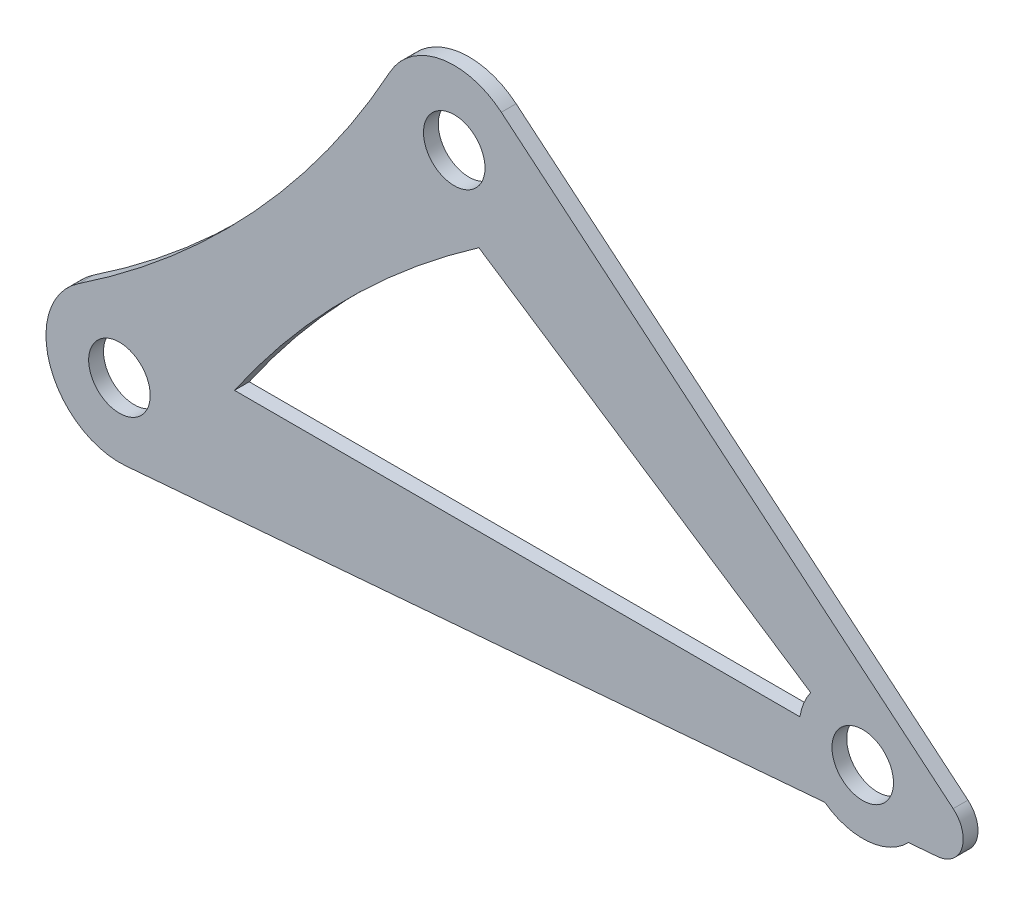
ISO-10303-21;
HEADER;
FILE_DESCRIPTION(('STEP AP214'),'2;1');
FILE_NAME('part.step','',(''),(''),'','','');
FILE_SCHEMA(('AUTOMOTIVE_DESIGN { 1 0 10303 214 1 1 1 1 }'));
ENDSEC;
DATA;
#1=APPLICATION_CONTEXT('core data for automotive mechanical design processes');
#2=APPLICATION_PROTOCOL_DEFINITION('international standard','automotive_design',2000,#1);
#3=PRODUCT_CONTEXT('',#1,'mechanical');
#4=PRODUCT('Part','Part','',(#3));
#5=PRODUCT_RELATED_PRODUCT_CATEGORY('part','',(#4));
#6=PRODUCT_DEFINITION_FORMATION('','',#4);
#7=PRODUCT_DEFINITION_CONTEXT('part definition',#1,'design');
#8=PRODUCT_DEFINITION('design','',#6,#7);
#9=PRODUCT_DEFINITION_SHAPE('','',#8);
#10=(LENGTH_UNIT() NAMED_UNIT(*) SI_UNIT(.MILLI.,.METRE.));
#11=(NAMED_UNIT(*) PLANE_ANGLE_UNIT() SI_UNIT($,.RADIAN.));
#12=(NAMED_UNIT(*) SI_UNIT($,.STERADIAN.) SOLID_ANGLE_UNIT());
#13=UNCERTAINTY_MEASURE_WITH_UNIT(LENGTH_MEASURE(1.E-05),#10,'distance_accuracy_value','');
#14=(GEOMETRIC_REPRESENTATION_CONTEXT(3) GLOBAL_UNCERTAINTY_ASSIGNED_CONTEXT((#13)) GLOBAL_UNIT_ASSIGNED_CONTEXT((#10,
#11,#12)) REPRESENTATION_CONTEXT('',''));
#15=CARTESIAN_POINT('',(0.,0.,0.));
#16=DIRECTION('',(0.,0.,1.));
#17=DIRECTION('',(1.,0.,0.));
#18=AXIS2_PLACEMENT_3D('',#15,#16,#17);
#19=CARTESIAN_POINT('',(-157.165870572563,93.085119743482,1.587));
#20=DIRECTION('',(0.,0.,-1.));
#21=DIRECTION('',(-1.,0.,0.));
#22=AXIS2_PLACEMENT_3D('',#19,#20,#21);
#23=CYLINDRICAL_SURFACE('',#22,104.);
#24=CARTESIAN_POINT('',(-157.165870572563,93.085119743482,0.));
#25=DIRECTION('',(0.,0.,1.));
#26=DIRECTION('',(1.,0.,0.));
#27=AXIS2_PLACEMENT_3D('',#24,#25,#26);
#28=CIRCLE('',#27,104.);
#29=CARTESIAN_POINT('',(-66.0670444084238,42.915369180858,0.));
#30=VERTEX_POINT('',#29);
#31=CARTESIAN_POINT('',(-99.4647440627846,6.56009446464992,0.));
#32=VERTEX_POINT('',#31);
#33=EDGE_CURVE('E216',#30,#32,#28,.F.);
#34=ORIENTED_EDGE('',*,*,#33,.T.);
#35=DIRECTION('',(0.,0.,-1.));
#36=VECTOR('',#35,1.);
#37=CARTESIAN_POINT('',(-99.4647440627846,6.56009446464992,1.587));
#38=LINE('',#37,#36);
#39=CARTESIAN_POINT('',(-99.4647440627846,6.56009446464992,1.587));
#40=VERTEX_POINT('',#39);
#41=EDGE_CURVE('E269',#40,#32,#38,.T.);
#42=ORIENTED_EDGE('',*,*,#41,.F.);
#43=CARTESIAN_POINT('',(-157.165870572563,93.085119743482,1.587));
#44=DIRECTION('',(0.,0.,1.));
#45=DIRECTION('',(1.,0.,0.));
#46=AXIS2_PLACEMENT_3D('',#43,#44,#45);
#47=CIRCLE('',#46,104.);
#48=CARTESIAN_POINT('',(-66.0670444084238,42.915369180858,1.587));
#49=VERTEX_POINT('',#48);
#50=EDGE_CURVE('E168',#49,#40,#47,.F.);
#51=ORIENTED_EDGE('',*,*,#50,.F.);
#52=DIRECTION('',(0.,0.,-1.));
#53=VECTOR('',#52,1.);
#54=CARTESIAN_POINT('',(-66.0670444084238,42.915369180858,1.587));
#55=LINE('',#54,#53);
#56=EDGE_CURVE('E154',#49,#30,#55,.T.);
#57=ORIENTED_EDGE('',*,*,#56,.T.);
#58=EDGE_LOOP('',(#34,#42,#51,#57));
#59=FACE_BOUND('',#58,.T.);
#60=ADVANCED_FACE('F43',(#59),#23,.F.);
#61=CARTESIAN_POINT('',(-95.09,0.,1.587));
#62=DIRECTION('',(0.,0.,-1.));
#63=DIRECTION('',(-1.,0.,0.));
#64=AXIS2_PLACEMENT_3D('',#61,#62,#63);
#65=CYLINDRICAL_SURFACE('',#64,7.885);
#66=CARTESIAN_POINT('',(-95.09,0.,0.));
#67=DIRECTION('',(0.,0.,1.));
#68=DIRECTION('',(1.,0.,0.));
#69=AXIS2_PLACEMENT_3D('',#66,#67,#68);
#70=CIRCLE('',#69,7.885);
#71=CARTESIAN_POINT('',(-94.4361644231781,-7.85784474512458,0.));
#72=VERTEX_POINT('',#71);
#73=EDGE_CURVE('E220',#32,#72,#70,.T.);
#74=ORIENTED_EDGE('',*,*,#73,.T.);
#75=DIRECTION('',(0.,0.,-1.));
#76=VECTOR('',#75,1.);
#77=CARTESIAN_POINT('',(-94.4361644231781,-7.85784474512458,1.587));
#78=LINE('',#77,#76);
#79=CARTESIAN_POINT('',(-94.4361644231781,-7.85784474512458,1.587));
#80=VERTEX_POINT('',#79);
#81=EDGE_CURVE('E266',#80,#72,#78,.T.);
#82=ORIENTED_EDGE('',*,*,#81,.F.);
#83=CARTESIAN_POINT('',(-95.09,0.,1.587));
#84=DIRECTION('',(0.,0.,1.));
#85=DIRECTION('',(1.,0.,0.));
#86=AXIS2_PLACEMENT_3D('',#83,#84,#85);
#87=CIRCLE('',#86,7.885);
#88=EDGE_CURVE('E172',#40,#80,#87,.T.);
#89=ORIENTED_EDGE('',*,*,#88,.F.);
#90=ORIENTED_EDGE('',*,*,#41,.T.);
#91=EDGE_LOOP('',(#74,#82,#89,#90));
#92=FACE_BOUND('',#91,.T.);
#93=ADVANCED_FACE('F341',(#92),#65,.T.);
#94=CARTESIAN_POINT('',(0.,0.,1.587));
#95=DIRECTION('',(0.0829214428436218,-0.99655608688961,0.));
#96=DIRECTION('',(0.99655608688961,0.0829214428436218,0.));
#97=AXIS2_PLACEMENT_3D('',#94,#95,#96);
#98=PLANE('',#97);
#99=DIRECTION('',(-0.99655608688961,-0.0829214428436219,0.));
#100=VECTOR('',#99,1.);
#101=CARTESIAN_POINT('',(0.,0.,0.));
#102=LINE('',#101,#100);
#103=CARTESIAN_POINT('',(-19.3842778919593,-1.61292707197226,0.));
#104=VERTEX_POINT('',#103);
#105=EDGE_CURVE('E224',#104,#72,#102,.T.);
#106=ORIENTED_EDGE('',*,*,#105,.F.);
#107=DIRECTION('',(0.,0.,-1.));
#108=VECTOR('',#107,1.);
#109=CARTESIAN_POINT('',(-19.3842778919593,-1.61292707197226,1.587));
#110=LINE('',#109,#108);
#111=CARTESIAN_POINT('',(-19.3842778919593,-1.61292707197226,1.587));
#112=VERTEX_POINT('',#111);
#113=EDGE_CURVE('E263',#112,#104,#110,.T.);
#114=ORIENTED_EDGE('',*,*,#113,.F.);
#115=DIRECTION('',(-0.99655608688961,-0.0829214428436219,0.));
#116=VECTOR('',#115,1.);
#117=CARTESIAN_POINT('',(0.,0.,1.587));
#118=LINE('',#117,#116);
#119=EDGE_CURVE('E175',#112,#80,#118,.T.);
#120=ORIENTED_EDGE('',*,*,#119,.T.);
#121=ORIENTED_EDGE('',*,*,#81,.T.);
#122=EDGE_LOOP('',(#106,#114,#120,#121));
#123=FACE_BOUND('',#122,.T.);
#124=ADVANCED_FACE('F346',(#123),#98,.T.);
#125=CARTESIAN_POINT('',(-15.3218333954721,3.885,1.587));
#126=DIRECTION('',(0.,0.,-1.));
#127=DIRECTION('',(-1.,0.,0.));
#128=AXIS2_PLACEMENT_3D('',#125,#126,#127);
#129=CYLINDRICAL_SURFACE('',#128,6.83598254647897);
#130=CARTESIAN_POINT('',(-15.3218333954721,3.885,0.));
#131=DIRECTION('',(0.,0.,1.));
#132=DIRECTION('',(1.,0.,0.));
#133=AXIS2_PLACEMENT_3D('',#130,#131,#132);
#134=CIRCLE('',#133,6.83598254647897);
#135=CARTESIAN_POINT('',(-10.4066033987028,-0.865912697011469,0.));
#136=VERTEX_POINT('',#135);
#137=EDGE_CURVE('E228',#104,#136,#134,.T.);
#138=ORIENTED_EDGE('',*,*,#137,.T.);
#139=DIRECTION('',(0.,0.,-1.));
#140=VECTOR('',#139,1.);
#141=CARTESIAN_POINT('',(-10.4066033987028,-0.865912697011469,1.587));
#142=LINE('',#141,#140);
#143=CARTESIAN_POINT('',(-10.4066033987028,-0.865912697011469,1.587));
#144=VERTEX_POINT('',#143);
#145=EDGE_CURVE('E259',#144,#136,#142,.T.);
#146=ORIENTED_EDGE('',*,*,#145,.F.);
#147=CARTESIAN_POINT('',(-15.3218333954721,3.885,1.587));
#148=DIRECTION('',(0.,0.,1.));
#149=DIRECTION('',(1.,0.,0.));
#150=AXIS2_PLACEMENT_3D('',#147,#148,#149);
#151=CIRCLE('',#150,6.83598254647897);
#152=EDGE_CURVE('E179',#112,#144,#151,.T.);
#153=ORIENTED_EDGE('',*,*,#152,.F.);
#154=ORIENTED_EDGE('',*,*,#113,.T.);
#155=EDGE_LOOP('',(#138,#146,#153,#154));
#156=FACE_BOUND('',#155,.T.);
#157=ADVANCED_FACE('F373',(#156),#129,.T.);
#158=CARTESIAN_POINT('',(0.,0.,1.587));
#159=DIRECTION('',(0.0829214428436218,-0.99655608688961,0.));
#160=DIRECTION('',(0.99655608688961,0.0829214428436218,0.));
#161=AXIS2_PLACEMENT_3D('',#158,#159,#160);
#162=PLANE('',#161);
#163=DIRECTION('',(-0.99655608688961,-0.0829214428436219,0.));
#164=VECTOR('',#163,1.);
#165=CARTESIAN_POINT('',(0.,0.,0.));
#166=LINE('',#165,#164);
#167=CARTESIAN_POINT('',(-7.28789729550852,-0.606411387166248,0.));
#168=VERTEX_POINT('',#167);
#169=EDGE_CURVE('E232',#168,#136,#166,.T.);
#170=ORIENTED_EDGE('',*,*,#169,.F.);
#171=DIRECTION('',(0.,0.,-1.));
#172=VECTOR('',#171,1.);
#173=CARTESIAN_POINT('',(-7.28789729550852,-0.606411387166247,1.587));
#174=LINE('',#173,#172);
#175=CARTESIAN_POINT('',(-7.28789729550852,-0.606411387166248,1.587));
#176=VERTEX_POINT('',#175);
#177=EDGE_CURVE('E52',#168,#176,#174,.F.);
#178=ORIENTED_EDGE('',*,*,#177,.T.);
#179=DIRECTION('',(-0.99655608688961,-0.0829214428436219,0.));
#180=VECTOR('',#179,1.);
#181=CARTESIAN_POINT('',(0.,0.,1.587));
#182=LINE('',#181,#180);
#183=EDGE_CURVE('E183',#176,#144,#182,.T.);
#184=ORIENTED_EDGE('',*,*,#183,.T.);
#185=ORIENTED_EDGE('',*,*,#145,.T.);
#186=EDGE_LOOP('',(#170,#178,#184,#185));
#187=FACE_BOUND('',#186,.T.);
#188=ADVANCED_FACE('F367',(#187),#162,.T.);
#189=CARTESIAN_POINT('',(0.,0.,1.587));
#190=DIRECTION('',(-0.640815984493603,-0.767694518684023,0.));
#191=DIRECTION('',(0.767694518684024,-0.640815984493603,0.));
#192=AXIS2_PLACEMENT_3D('',#189,#190,#191);
#193=PLANE('',#192);
#194=DIRECTION('',(-0.767694518684023,0.640815984493603,0.));
#195=VECTOR('',#194,1.);
#196=CARTESIAN_POINT('',(0.,0.,1.587));
#197=LINE('',#196,#195);
#198=CARTESIAN_POINT('',(-5.61421367055858,4.68634042955465,1.587));
#199=VERTEX_POINT('',#198);
#200=CARTESIAN_POINT('',(-54.1073426369971,45.1649050454287,1.587));
#201=VERTEX_POINT('',#200);
#202=EDGE_CURVE('E186',#199,#201,#197,.T.);
#203=ORIENTED_EDGE('',*,*,#202,.F.);
#204=DIRECTION('',(0.,0.,-1.));
#205=VECTOR('',#204,1.);
#206=CARTESIAN_POINT('',(-5.61421367055858,4.68634042955465,0.));
#207=LINE('',#206,#205);
#208=CARTESIAN_POINT('',(-5.61421367055858,4.68634042955465,0.));
#209=VERTEX_POINT('',#208);
#210=EDGE_CURVE('E273',#199,#209,#207,.T.);
#211=ORIENTED_EDGE('',*,*,#210,.T.);
#212=DIRECTION('',(-0.767694518684023,0.640815984493603,0.));
#213=VECTOR('',#212,1.);
#214=CARTESIAN_POINT('',(0.,0.,0.));
#215=LINE('',#214,#213);
#216=CARTESIAN_POINT('',(-54.1073426369971,45.1649050454287,0.));
#217=VERTEX_POINT('',#216);
#218=EDGE_CURVE('E235',#209,#217,#215,.T.);
#219=ORIENTED_EDGE('',*,*,#218,.T.);
#220=DIRECTION('',(0.,0.,-1.));
#221=VECTOR('',#220,1.);
#222=CARTESIAN_POINT('',(-54.1073426369971,45.1649050454287,1.587));
#223=LINE('',#222,#221);
#224=EDGE_CURVE('E255',#201,#217,#223,.T.);
#225=ORIENTED_EDGE('',*,*,#224,.F.);
#226=EDGE_LOOP('',(#203,#211,#219,#225));
#227=FACE_BOUND('',#226,.T.);
#228=ADVANCED_FACE('F316',(#227),#193,.F.);
#229=CARTESIAN_POINT('',(0.,5.,1.587));
#230=DIRECTION('',(0.,-1.,0.));
#231=DIRECTION('',(0.,0.,-1.));
#232=AXIS2_PLACEMENT_3D('',#229,#230,#231);
#233=PLANE('',#232);
#234=DIRECTION('',(-1.,0.,0.));
#235=VECTOR('',#234,1.);
#236=CARTESIAN_POINT('',(0.,5.,0.));
#237=LINE('',#236,#235);
#238=CARTESIAN_POINT('',(-22.0662705384637,5.,0.));
#239=VERTEX_POINT('',#238);
#240=CARTESIAN_POINT('',(-82.7471799251774,5.,0.));
#241=VERTEX_POINT('',#240);
#242=EDGE_CURVE('E149',#239,#241,#237,.T.);
#243=ORIENTED_EDGE('',*,*,#242,.T.);
#244=DIRECTION('',(0.,0.,-1.));
#245=VECTOR('',#244,1.);
#246=CARTESIAN_POINT('',(-82.7471799251774,5.,1.587));
#247=LINE('',#246,#245);
#248=CARTESIAN_POINT('',(-82.7471799251774,5.,1.587));
#249=VERTEX_POINT('',#248);
#250=EDGE_CURVE('E146',#249,#241,#247,.T.);
#251=ORIENTED_EDGE('',*,*,#250,.F.);
#252=DIRECTION('',(-1.,0.,0.));
#253=VECTOR('',#252,1.);
#254=CARTESIAN_POINT('',(0.,5.,1.587));
#255=LINE('',#254,#253);
#256=CARTESIAN_POINT('',(-22.0662705384637,5.,1.587));
#257=VERTEX_POINT('',#256);
#258=EDGE_CURVE('E131',#257,#249,#255,.T.);
#259=ORIENTED_EDGE('',*,*,#258,.F.);
#260=DIRECTION('',(0.,0.,-1.));
#261=VECTOR('',#260,1.);
#262=CARTESIAN_POINT('',(-22.0662705384637,5.,1.587));
#263=LINE('',#262,#261);
#264=EDGE_CURVE('E204',#257,#239,#263,.T.);
#265=ORIENTED_EDGE('',*,*,#264,.T.);
#266=EDGE_LOOP('',(#243,#251,#259,#265));
#267=FACE_BOUND('',#266,.T.);
#268=ADVANCED_FACE('F147',(#267),#233,.F.);
#269=CARTESIAN_POINT('',(2.91569389783397,-53.9734859778768,1.587));
#270=DIRECTION('',(0.,0.,-1.));
#271=DIRECTION('',(-1.,0.,0.));
#272=AXIS2_PLACEMENT_3D('',#269,#270,#271);
#273=CYLINDRICAL_SURFACE('',#272,104.);
#274=CARTESIAN_POINT('',(2.91569389783397,-53.9734859778768,0.));
#275=DIRECTION('',(0.,0.,1.));
#276=DIRECTION('',(1.,0.,0.));
#277=AXIS2_PLACEMENT_3D('',#274,#275,#276);
#278=CIRCLE('',#277,104.);
#279=CARTESIAN_POINT('',(-56.5178368747984,31.3708484556318,0.));
#280=VERTEX_POINT('',#279);
#281=EDGE_CURVE('E207',#280,#241,#278,.T.);
#282=ORIENTED_EDGE('',*,*,#281,.F.);
#283=DIRECTION('',(0.,0.,-1.));
#284=VECTOR('',#283,1.);
#285=CARTESIAN_POINT('',(-56.5178368747984,31.3708484556318,1.587));
#286=LINE('',#285,#284);
#287=CARTESIAN_POINT('',(-56.5178368747984,31.3708484556318,1.587));
#288=VERTEX_POINT('',#287);
#289=EDGE_CURVE('E155',#288,#280,#286,.T.);
#290=ORIENTED_EDGE('',*,*,#289,.F.);
#291=CARTESIAN_POINT('',(2.91569389783397,-53.9734859778768,1.587));
#292=DIRECTION('',(0.,0.,1.));
#293=DIRECTION('',(1.,0.,0.));
#294=AXIS2_PLACEMENT_3D('',#291,#292,#293);
#295=CIRCLE('',#294,104.);
#296=EDGE_CURVE('E136',#288,#249,#295,.T.);
#297=ORIENTED_EDGE('',*,*,#296,.T.);
#298=ORIENTED_EDGE('',*,*,#250,.T.);
#299=EDGE_LOOP('',(#282,#290,#297,#298));
#300=FACE_BOUND('',#299,.T.);
#301=ADVANCED_FACE('F157',(#300),#273,.F.);
#302=CARTESIAN_POINT('',(-2.75744738900206,-4.17090924102716,1.587));
#303=DIRECTION('',(0.551489477800412,0.834181848205431,0.));
#304=DIRECTION('',(-0.834181848205431,0.551489477800412,0.));
#305=AXIS2_PLACEMENT_3D('',#302,#303,#304);
#306=PLANE('',#305);
#307=DIRECTION('',(0.834181848205431,-0.551489477800412,0.));
#308=VECTOR('',#307,1.);
#309=CARTESIAN_POINT('',(-2.75744738900206,-4.17090924102716,0.));
#310=LINE('',#309,#308);
#311=CARTESIAN_POINT('',(-20.9063395896875,7.82758138058497,0.));
#312=VERTEX_POINT('',#311);
#313=EDGE_CURVE('E210',#280,#312,#310,.T.);
#314=ORIENTED_EDGE('',*,*,#313,.T.);
#315=DIRECTION('',(0.,0.,-1.));
#316=VECTOR('',#315,1.);
#317=CARTESIAN_POINT('',(-20.9063395896875,7.82758138058497,1.587));
#318=LINE('',#317,#316);
#319=CARTESIAN_POINT('',(-20.9063395896875,7.82758138058497,1.587));
#320=VERTEX_POINT('',#319);
#321=EDGE_CURVE('E276',#320,#312,#318,.T.);
#322=ORIENTED_EDGE('',*,*,#321,.F.);
#323=DIRECTION('',(0.834181848205431,-0.551489477800412,0.));
#324=VECTOR('',#323,1.);
#325=CARTESIAN_POINT('',(-2.75744738900206,-4.17090924102716,1.587));
#326=LINE('',#325,#324);
#327=EDGE_CURVE('E160',#288,#320,#326,.T.);
#328=ORIENTED_EDGE('',*,*,#327,.F.);
#329=ORIENTED_EDGE('',*,*,#289,.T.);
#330=EDGE_LOOP('',(#314,#322,#328,#329));
#331=FACE_BOUND('',#330,.T.);
#332=ADVANCED_FACE('F356',(#331),#306,.F.);
#333=CARTESIAN_POINT('',(-59.1601766747292,39.1116337656052,1.587));
#334=DIRECTION('',(0.,0.,-1.));
#335=DIRECTION('',(-1.,0.,0.));
#336=AXIS2_PLACEMENT_3D('',#333,#334,#335);
#337=CYLINDRICAL_SURFACE('',#336,3.302);
#338=CARTESIAN_POINT('',(-59.1601766747292,39.1116337656052,1.587));
#339=DIRECTION('',(0.,0.,1.));
#340=DIRECTION('',(1.,0.,0.));
#341=AXIS2_PLACEMENT_3D('',#338,#339,#340);
#342=CIRCLE('',#341,3.302);
#343=CARTESIAN_POINT('',(-55.8581766747292,39.1116337656052,1.587));
#344=VERTEX_POINT('',#343);
#345=EDGE_CURVE('E196',#344,#344,#342,.T.);
#346=ORIENTED_EDGE('',*,*,#345,.T.);
#347=EDGE_LOOP('',(#346));
#348=FACE_BOUND('',#347,.T.);
#349=CARTESIAN_POINT('',(-59.1601766747292,39.1116337656052,0.));
#350=DIRECTION('',(0.,0.,1.));
#351=DIRECTION('',(1.,0.,0.));
#352=AXIS2_PLACEMENT_3D('',#349,#350,#351);
#353=CIRCLE('',#352,3.302);
#354=CARTESIAN_POINT('',(-55.8581766747292,39.1116337656052,0.));
#355=VERTEX_POINT('',#354);
#356=EDGE_CURVE('E245',#355,#355,#353,.T.);
#357=ORIENTED_EDGE('',*,*,#356,.F.);
#358=EDGE_LOOP('',(#357));
#359=FACE_BOUND('',#358,.T.);
#360=ADVANCED_FACE('F359',(#348,#359),#337,.F.);
#361=CARTESIAN_POINT('',(-15.3218333954721,3.885,1.587));
#362=DIRECTION('',(0.,0.,-1.));
#363=DIRECTION('',(-1.,0.,0.));
#364=AXIS2_PLACEMENT_3D('',#361,#362,#363);
#365=CYLINDRICAL_SURFACE('',#364,3.302);
#366=CARTESIAN_POINT('',(-15.3218333954721,3.885,1.587));
#367=DIRECTION('',(0.,0.,1.));
#368=DIRECTION('',(1.,0.,0.));
#369=AXIS2_PLACEMENT_3D('',#366,#367,#368);
#370=CIRCLE('',#369,3.302);
#371=CARTESIAN_POINT('',(-12.0198333954721,3.885,1.587));
#372=VERTEX_POINT('',#371);
#373=EDGE_CURVE('E192',#372,#372,#370,.T.);
#374=ORIENTED_EDGE('',*,*,#373,.T.);
#375=EDGE_LOOP('',(#374));
#376=FACE_BOUND('',#375,.T.);
#377=CARTESIAN_POINT('',(-15.3218333954721,3.885,0.));
#378=DIRECTION('',(0.,0.,1.));
#379=DIRECTION('',(1.,0.,0.));
#380=AXIS2_PLACEMENT_3D('',#377,#378,#379);
#381=CIRCLE('',#380,3.302);
#382=CARTESIAN_POINT('',(-12.0198333954721,3.885,0.));
#383=VERTEX_POINT('',#382);
#384=EDGE_CURVE('E241',#383,#383,#381,.T.);
#385=ORIENTED_EDGE('',*,*,#384,.F.);
#386=EDGE_LOOP('',(#385));
#387=FACE_BOUND('',#386,.T.);
#388=ADVANCED_FACE('F431',(#376,#387),#365,.F.);
#389=CARTESIAN_POINT('',(-59.1601766747292,39.1116337656052,1.587));
#390=DIRECTION('',(0.,0.,-1.));
#391=DIRECTION('',(-1.,0.,0.));
#392=AXIS2_PLACEMENT_3D('',#389,#390,#391);
#393=CYLINDRICAL_SURFACE('',#392,7.885);
#394=CARTESIAN_POINT('',(-59.1601766747292,39.1116337656052,0.));
#395=DIRECTION('',(0.,0.,1.));
#396=DIRECTION('',(1.,0.,0.));
#397=AXIS2_PLACEMENT_3D('',#394,#395,#396);
#398=CIRCLE('',#397,7.885);
#399=EDGE_CURVE('E238',#217,#30,#398,.T.);
#400=ORIENTED_EDGE('',*,*,#399,.T.);
#401=ORIENTED_EDGE('',*,*,#56,.F.);
#402=CARTESIAN_POINT('',(-59.1601766747292,39.1116337656052,1.587));
#403=DIRECTION('',(0.,0.,1.));
#404=DIRECTION('',(1.,0.,0.));
#405=AXIS2_PLACEMENT_3D('',#402,#403,#404);
#406=CIRCLE('',#405,7.885);
#407=EDGE_CURVE('E189',#201,#49,#406,.T.);
#408=ORIENTED_EDGE('',*,*,#407,.F.);
#409=ORIENTED_EDGE('',*,*,#224,.T.);
#410=EDGE_LOOP('',(#400,#401,#408,#409));
#411=FACE_BOUND('',#410,.T.);
#412=ADVANCED_FACE('F326',(#411),#393,.T.);
#413=CARTESIAN_POINT('',(-15.3218333954721,3.885,1.587));
#414=DIRECTION('',(0.,0.,-1.));
#415=DIRECTION('',(-1.,0.,0.));
#416=AXIS2_PLACEMENT_3D('',#413,#414,#415);
#417=CYLINDRICAL_SURFACE('',#416,6.83598254647897);
#418=CARTESIAN_POINT('',(-15.3218333954721,3.885,0.));
#419=DIRECTION('',(0.,0.,1.));
#420=DIRECTION('',(1.,0.,0.));
#421=AXIS2_PLACEMENT_3D('',#418,#419,#420);
#422=CIRCLE('',#421,6.83598254647897);
#423=EDGE_CURVE('E213',#312,#239,#422,.T.);
#424=ORIENTED_EDGE('',*,*,#423,.T.);
#425=ORIENTED_EDGE('',*,*,#264,.F.);
#426=CARTESIAN_POINT('',(-15.3218333954721,3.885,1.587));
#427=DIRECTION('',(0.,0.,1.));
#428=DIRECTION('',(1.,0.,0.));
#429=AXIS2_PLACEMENT_3D('',#426,#427,#428);
#430=CIRCLE('',#429,6.83598254647897);
#431=EDGE_CURVE('E138',#320,#257,#430,.T.);
#432=ORIENTED_EDGE('',*,*,#431,.F.);
#433=ORIENTED_EDGE('',*,*,#321,.T.);
#434=EDGE_LOOP('',(#424,#425,#432,#433));
#435=FACE_BOUND('',#434,.T.);
#436=ADVANCED_FACE('F351',(#435),#417,.T.);
#437=CARTESIAN_POINT('',(-95.09,0.,1.587));
#438=DIRECTION('',(0.,0.,-1.));
#439=DIRECTION('',(-1.,0.,0.));
#440=AXIS2_PLACEMENT_3D('',#437,#438,#439);
#441=CYLINDRICAL_SURFACE('',#440,3.302);
#442=CARTESIAN_POINT('',(-95.09,0.,1.587));
#443=DIRECTION('',(0.,0.,1.));
#444=DIRECTION('',(1.,0.,0.));
#445=AXIS2_PLACEMENT_3D('',#442,#443,#444);
#446=CIRCLE('',#445,3.302);
#447=CARTESIAN_POINT('',(-91.788,0.,1.587));
#448=VERTEX_POINT('',#447);
#449=EDGE_CURVE('E200',#448,#448,#446,.T.);
#450=ORIENTED_EDGE('',*,*,#449,.T.);
#451=EDGE_LOOP('',(#450));
#452=FACE_BOUND('',#451,.T.);
#453=CARTESIAN_POINT('',(-95.09,0.,0.));
#454=DIRECTION('',(0.,0.,1.));
#455=DIRECTION('',(1.,0.,0.));
#456=AXIS2_PLACEMENT_3D('',#453,#454,#455);
#457=CIRCLE('',#456,3.302);
#458=CARTESIAN_POINT('',(-91.788,0.,0.));
#459=VERTEX_POINT('',#458);
#460=EDGE_CURVE('E143',#459,#459,#457,.T.);
#461=ORIENTED_EDGE('',*,*,#460,.F.);
#462=EDGE_LOOP('',(#461));
#463=FACE_BOUND('',#462,.T.);
#464=ADVANCED_FACE('F354',(#452,#463),#441,.F.);
#465=CARTESIAN_POINT('',(0.,0.,1.587));
#466=DIRECTION('',(0.,0.,1.));
#467=DIRECTION('',(1.,0.,0.));
#468=AXIS2_PLACEMENT_3D('',#465,#466,#467);
#469=PLANE('',#468);
#470=ORIENTED_EDGE('',*,*,#258,.T.);
#471=ORIENTED_EDGE('',*,*,#296,.F.);
#472=ORIENTED_EDGE('',*,*,#327,.T.);
#473=ORIENTED_EDGE('',*,*,#431,.T.);
#474=EDGE_LOOP('',(#470,#471,#472,#473));
#475=FACE_BOUND('',#474,.T.);
#476=ORIENTED_EDGE('',*,*,#183,.F.);
#477=CARTESIAN_POINT('',(-7.53666162403939,2.38325687350258,1.587));
#478=DIRECTION('',(0.,0.,1.));
#479=DIRECTION('',(1.,0.,0.));
#480=AXIS2_PLACEMENT_3D('',#477,#478,#479);
#481=CIRCLE('',#480,3.);
#482=EDGE_CURVE('E11',#176,#199,#481,.T.);
#483=ORIENTED_EDGE('',*,*,#482,.T.);
#484=ORIENTED_EDGE('',*,*,#202,.T.);
#485=ORIENTED_EDGE('',*,*,#407,.T.);
#486=ORIENTED_EDGE('',*,*,#50,.T.);
#487=ORIENTED_EDGE('',*,*,#88,.T.);
#488=ORIENTED_EDGE('',*,*,#119,.F.);
#489=ORIENTED_EDGE('',*,*,#152,.T.);
#490=EDGE_LOOP('',(#476,#483,#484,#485,#486,#487,#488,#489));
#491=FACE_BOUND('',#490,.T.);
#492=ORIENTED_EDGE('',*,*,#373,.F.);
#493=EDGE_LOOP('',(#492));
#494=FACE_BOUND('',#493,.T.);
#495=ORIENTED_EDGE('',*,*,#345,.F.);
#496=EDGE_LOOP('',(#495));
#497=FACE_BOUND('',#496,.T.);
#498=ORIENTED_EDGE('',*,*,#449,.F.);
#499=EDGE_LOOP('',(#498));
#500=FACE_BOUND('',#499,.T.);
#501=ADVANCED_FACE('F133',(#475,#491,#494,#497,#500),#469,.T.);
#502=CARTESIAN_POINT('',(0.,0.,0.));
#503=DIRECTION('',(0.,0.,1.));
#504=DIRECTION('',(1.,0.,0.));
#505=AXIS2_PLACEMENT_3D('',#502,#503,#504);
#506=PLANE('',#505);
#507=ORIENTED_EDGE('',*,*,#242,.F.);
#508=ORIENTED_EDGE('',*,*,#423,.F.);
#509=ORIENTED_EDGE('',*,*,#313,.F.);
#510=ORIENTED_EDGE('',*,*,#281,.T.);
#511=EDGE_LOOP('',(#507,#508,#509,#510));
#512=FACE_BOUND('',#511,.T.);
#513=ORIENTED_EDGE('',*,*,#218,.F.);
#514=CARTESIAN_POINT('',(-7.53666162403939,2.38325687350258,0.));
#515=DIRECTION('',(0.,0.,1.));
#516=DIRECTION('',(1.,0.,0.));
#517=AXIS2_PLACEMENT_3D('',#514,#515,#516);
#518=CIRCLE('',#517,3.);
#519=EDGE_CURVE('E66',#209,#168,#518,.F.);
#520=ORIENTED_EDGE('',*,*,#519,.T.);
#521=ORIENTED_EDGE('',*,*,#169,.T.);
#522=ORIENTED_EDGE('',*,*,#137,.F.);
#523=ORIENTED_EDGE('',*,*,#105,.T.);
#524=ORIENTED_EDGE('',*,*,#73,.F.);
#525=ORIENTED_EDGE('',*,*,#33,.F.);
#526=ORIENTED_EDGE('',*,*,#399,.F.);
#527=EDGE_LOOP('',(#513,#520,#521,#522,#523,#524,#525,#526));
#528=FACE_BOUND('',#527,.T.);
#529=ORIENTED_EDGE('',*,*,#384,.T.);
#530=EDGE_LOOP('',(#529));
#531=FACE_BOUND('',#530,.T.);
#532=ORIENTED_EDGE('',*,*,#356,.T.);
#533=EDGE_LOOP('',(#532));
#534=FACE_BOUND('',#533,.T.);
#535=ORIENTED_EDGE('',*,*,#460,.T.);
#536=EDGE_LOOP('',(#535));
#537=FACE_BOUND('',#536,.T.);
#538=ADVANCED_FACE('F321',(#512,#528,#531,#534,#537),#506,.F.);
#539=CARTESIAN_POINT('',(-7.53666162403939,2.38325687350258,1.587));
#540=DIRECTION('',(0.,0.,1.));
#541=DIRECTION('',(1.,0.,0.));
#542=AXIS2_PLACEMENT_3D('',#539,#540,#541);
#543=CYLINDRICAL_SURFACE('',#542,3.);
#544=ORIENTED_EDGE('',*,*,#482,.F.);
#545=ORIENTED_EDGE('',*,*,#177,.F.);
#546=ORIENTED_EDGE('',*,*,#519,.F.);
#547=ORIENTED_EDGE('',*,*,#210,.F.);
#548=EDGE_LOOP('',(#544,#545,#546,#547));
#549=FACE_BOUND('',#548,.T.);
#550=ADVANCED_FACE('F45',(#549),#543,.T.);
#551=CLOSED_SHELL('',(#60,#93,#124,#157,#188,#228,#268,#301,#332,#360,#388,#412,#436,#464,#501,
#538,#550));
#552=MANIFOLD_SOLID_BREP('B2',#551);
#553=ADVANCED_BREP_SHAPE_REPRESENTATION('',(#18,#552),#14);
#554=SHAPE_DEFINITION_REPRESENTATION(#9,#553);
ENDSEC;
END-ISO-10303-21;
